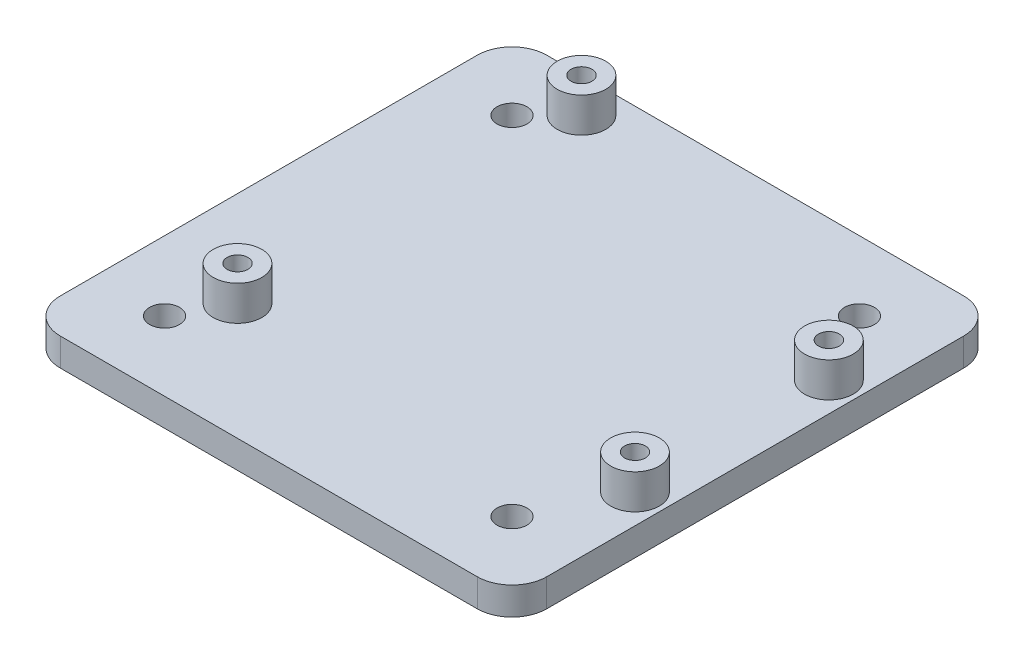
ISO-10303-21;
HEADER;
FILE_DESCRIPTION(('STEP AP214'),'2;1');
FILE_NAME('part.step','',(''),(''),'','','');
FILE_SCHEMA(('AUTOMOTIVE_DESIGN { 1 0 10303 214 1 1 1 1 }'));
ENDSEC;
DATA;
#1=APPLICATION_CONTEXT('core data for automotive mechanical design processes');
#2=APPLICATION_PROTOCOL_DEFINITION('international standard','automotive_design',2000,#1);
#3=PRODUCT_CONTEXT('',#1,'mechanical');
#4=PRODUCT('Part','Part','',(#3));
#5=PRODUCT_RELATED_PRODUCT_CATEGORY('part','',(#4));
#6=PRODUCT_DEFINITION_FORMATION('','',#4);
#7=PRODUCT_DEFINITION_CONTEXT('part definition',#1,'design');
#8=PRODUCT_DEFINITION('design','',#6,#7);
#9=PRODUCT_DEFINITION_SHAPE('','',#8);
#10=(LENGTH_UNIT() NAMED_UNIT(*) SI_UNIT(.MILLI.,.METRE.));
#11=(NAMED_UNIT(*) PLANE_ANGLE_UNIT() SI_UNIT($,.RADIAN.));
#12=(NAMED_UNIT(*) SI_UNIT($,.STERADIAN.) SOLID_ANGLE_UNIT());
#13=UNCERTAINTY_MEASURE_WITH_UNIT(LENGTH_MEASURE(1.E-05),#10,'distance_accuracy_value','');
#14=(GEOMETRIC_REPRESENTATION_CONTEXT(3) GLOBAL_UNCERTAINTY_ASSIGNED_CONTEXT((#13)) GLOBAL_UNIT_ASSIGNED_CONTEXT((#10,
#11,#12)) REPRESENTATION_CONTEXT('',''));
#15=CARTESIAN_POINT('',(0.,0.,0.));
#16=DIRECTION('',(0.,0.,1.));
#17=DIRECTION('',(1.,0.,0.));
#18=AXIS2_PLACEMENT_3D('',#15,#16,#17);
#19=CARTESIAN_POINT('',(0.,4.,0.));
#20=DIRECTION('',(0.,1.,0.));
#21=DIRECTION('',(0.,0.,1.));
#22=AXIS2_PLACEMENT_3D('',#19,#20,#21);
#23=PLANE('',#22);
#24=CARTESIAN_POINT('',(-21.3,4.,18.2));
#25=DIRECTION('',(0.,1.,0.));
#26=DIRECTION('',(0.,0.,1.));
#27=AXIS2_PLACEMENT_3D('',#24,#25,#26);
#28=CIRCLE('',#27,3.5);
#29=CARTESIAN_POINT('',(-21.3,4.,21.7));
#30=VERTEX_POINT('',#29);
#31=EDGE_CURVE('E240',#30,#30,#28,.T.);
#32=ORIENTED_EDGE('',*,*,#31,.F.);
#33=EDGE_LOOP('',(#32));
#34=FACE_BOUND('',#33,.T.);
#35=CARTESIAN_POINT('',(30.8,4.,13.1));
#36=DIRECTION('',(0.,1.,0.));
#37=DIRECTION('',(0.,0.,1.));
#38=AXIS2_PLACEMENT_3D('',#35,#36,#37);
#39=CIRCLE('',#38,3.5);
#40=CARTESIAN_POINT('',(30.8,4.,16.6));
#41=VERTEX_POINT('',#40);
#42=EDGE_CURVE('E231',#41,#41,#39,.T.);
#43=ORIENTED_EDGE('',*,*,#42,.F.);
#44=EDGE_LOOP('',(#43));
#45=FACE_BOUND('',#44,.T.);
#46=CARTESIAN_POINT('',(-20.,4.,-30.));
#47=DIRECTION('',(0.,1.,0.));
#48=DIRECTION('',(0.,0.,1.));
#49=AXIS2_PLACEMENT_3D('',#46,#47,#48);
#50=CIRCLE('',#49,3.5);
#51=CARTESIAN_POINT('',(-20.,4.,-26.5));
#52=VERTEX_POINT('',#51);
#53=EDGE_CURVE('E222',#52,#52,#50,.T.);
#54=ORIENTED_EDGE('',*,*,#53,.F.);
#55=EDGE_LOOP('',(#54));
#56=FACE_BOUND('',#55,.T.);
#57=CARTESIAN_POINT('',(30.8,4.,-14.8));
#58=DIRECTION('',(0.,1.,0.));
#59=DIRECTION('',(0.,0.,1.));
#60=AXIS2_PLACEMENT_3D('',#57,#58,#59);
#61=CIRCLE('',#60,3.5);
#62=CARTESIAN_POINT('',(30.8,4.,-11.3));
#63=VERTEX_POINT('',#62);
#64=EDGE_CURVE('E213',#63,#63,#61,.T.);
#65=ORIENTED_EDGE('',*,*,#64,.F.);
#66=EDGE_LOOP('',(#65));
#67=FACE_BOUND('',#66,.T.);
#68=CARTESIAN_POINT('',(-25.,4.,25.));
#69=DIRECTION('',(0.,1.,0.));
#70=DIRECTION('',(0.,0.,1.));
#71=AXIS2_PLACEMENT_3D('',#68,#69,#70);
#72=CIRCLE('',#71,2.15);
#73=CARTESIAN_POINT('',(-25.,4.,27.15));
#74=VERTEX_POINT('',#73);
#75=EDGE_CURVE('E198',#74,#74,#72,.T.);
#76=ORIENTED_EDGE('',*,*,#75,.F.);
#77=EDGE_LOOP('',(#76));
#78=FACE_BOUND('',#77,.T.);
#79=CARTESIAN_POINT('',(-25.,4.,-25.));
#80=DIRECTION('',(0.,1.,0.));
#81=DIRECTION('',(0.,0.,1.));
#82=AXIS2_PLACEMENT_3D('',#79,#80,#81);
#83=CIRCLE('',#82,2.15);
#84=CARTESIAN_POINT('',(-25.,4.,-22.85));
#85=VERTEX_POINT('',#84);
#86=EDGE_CURVE('E132',#85,#85,#83,.T.);
#87=ORIENTED_EDGE('',*,*,#86,.F.);
#88=EDGE_LOOP('',(#87));
#89=FACE_BOUND('',#88,.T.);
#90=DIRECTION('',(0.,0.,-1.));
#91=VECTOR('',#90,1.);
#92=CARTESIAN_POINT('',(35.,4.,-35.));
#93=LINE('',#92,#91);
#94=CARTESIAN_POINT('',(35.,4.,30.));
#95=VERTEX_POINT('',#94);
#96=CARTESIAN_POINT('',(35.,4.,-30.));
#97=VERTEX_POINT('',#96);
#98=EDGE_CURVE('E137',#95,#97,#93,.T.);
#99=ORIENTED_EDGE('',*,*,#98,.T.);
#100=CARTESIAN_POINT('',(30.,4.,-30.));
#101=DIRECTION('',(0.,1.,0.));
#102=DIRECTION('',(0.,0.,1.));
#103=AXIS2_PLACEMENT_3D('',#100,#101,#102);
#104=CIRCLE('',#103,5.);
#105=CARTESIAN_POINT('',(30.,4.,-35.));
#106=VERTEX_POINT('',#105);
#107=EDGE_CURVE('E164',#97,#106,#104,.T.);
#108=ORIENTED_EDGE('',*,*,#107,.T.);
#109=DIRECTION('',(-1.,0.,0.));
#110=VECTOR('',#109,1.);
#111=CARTESIAN_POINT('',(-35.,4.,-35.));
#112=LINE('',#111,#110);
#113=CARTESIAN_POINT('',(-30.,4.,-35.));
#114=VERTEX_POINT('',#113);
#115=EDGE_CURVE('E119',#106,#114,#112,.T.);
#116=ORIENTED_EDGE('',*,*,#115,.T.);
#117=CARTESIAN_POINT('',(-30.,4.,-30.));
#118=DIRECTION('',(0.,1.,0.));
#119=DIRECTION('',(0.,0.,1.));
#120=AXIS2_PLACEMENT_3D('',#117,#118,#119);
#121=CIRCLE('',#120,5.);
#122=CARTESIAN_POINT('',(-35.,4.,-30.));
#123=VERTEX_POINT('',#122);
#124=EDGE_CURVE('E159',#114,#123,#121,.T.);
#125=ORIENTED_EDGE('',*,*,#124,.T.);
#126=DIRECTION('',(0.,0.,1.));
#127=VECTOR('',#126,1.);
#128=CARTESIAN_POINT('',(-35.,4.,-35.));
#129=LINE('',#128,#127);
#130=CARTESIAN_POINT('',(-35.,4.,30.));
#131=VERTEX_POINT('',#130);
#132=EDGE_CURVE('E175',#123,#131,#129,.T.);
#133=ORIENTED_EDGE('',*,*,#132,.T.);
#134=CARTESIAN_POINT('',(-30.,4.,30.));
#135=DIRECTION('',(0.,1.,0.));
#136=DIRECTION('',(0.,0.,1.));
#137=AXIS2_PLACEMENT_3D('',#134,#135,#136);
#138=CIRCLE('',#137,5.);
#139=CARTESIAN_POINT('',(-30.,4.,35.));
#140=VERTEX_POINT('',#139);
#141=EDGE_CURVE('E55',#131,#140,#138,.T.);
#142=ORIENTED_EDGE('',*,*,#141,.T.);
#143=DIRECTION('',(1.,0.,0.));
#144=VECTOR('',#143,1.);
#145=CARTESIAN_POINT('',(-35.,4.,35.));
#146=LINE('',#145,#144);
#147=CARTESIAN_POINT('',(30.,4.,35.));
#148=VERTEX_POINT('',#147);
#149=EDGE_CURVE('E142',#140,#148,#146,.T.);
#150=ORIENTED_EDGE('',*,*,#149,.T.);
#151=CARTESIAN_POINT('',(30.,4.,30.));
#152=DIRECTION('',(0.,1.,0.));
#153=DIRECTION('',(0.,0.,1.));
#154=AXIS2_PLACEMENT_3D('',#151,#152,#153);
#155=CIRCLE('',#154,5.);
#156=EDGE_CURVE('E162',#148,#95,#155,.T.);
#157=ORIENTED_EDGE('',*,*,#156,.T.);
#158=EDGE_LOOP('',(#99,#108,#116,#125,#133,#142,#150,#157));
#159=FACE_BOUND('',#158,.T.);
#160=CARTESIAN_POINT('',(25.,4.,-25.));
#161=DIRECTION('',(0.,1.,0.));
#162=DIRECTION('',(0.,0.,1.));
#163=AXIS2_PLACEMENT_3D('',#160,#161,#162);
#164=CIRCLE('',#163,2.15);
#165=CARTESIAN_POINT('',(25.,4.,-22.85));
#166=VERTEX_POINT('',#165);
#167=EDGE_CURVE('E192',#166,#166,#164,.T.);
#168=ORIENTED_EDGE('',*,*,#167,.F.);
#169=EDGE_LOOP('',(#168));
#170=FACE_BOUND('',#169,.T.);
#171=CARTESIAN_POINT('',(25.,4.,25.));
#172=DIRECTION('',(0.,1.,0.));
#173=DIRECTION('',(0.,0.,1.));
#174=AXIS2_PLACEMENT_3D('',#171,#172,#173);
#175=CIRCLE('',#174,2.15);
#176=CARTESIAN_POINT('',(25.,4.,27.15));
#177=VERTEX_POINT('',#176);
#178=EDGE_CURVE('E204',#177,#177,#175,.T.);
#179=ORIENTED_EDGE('',*,*,#178,.F.);
#180=EDGE_LOOP('',(#179));
#181=FACE_BOUND('',#180,.T.);
#182=ADVANCED_FACE('F33',(#34,#45,#56,#67,#78,#89,#159,#170,#181),#23,.T.);
#183=CARTESIAN_POINT('',(0.,0.,0.));
#184=DIRECTION('',(0.,1.,0.));
#185=DIRECTION('',(0.,0.,1.));
#186=AXIS2_PLACEMENT_3D('',#183,#184,#185);
#187=PLANE('',#186);
#188=DIRECTION('',(-1.,0.,0.));
#189=VECTOR('',#188,1.);
#190=CARTESIAN_POINT('',(-35.,0.,-35.));
#191=LINE('',#190,#189);
#192=CARTESIAN_POINT('',(30.,0.,-35.));
#193=VERTEX_POINT('',#192);
#194=CARTESIAN_POINT('',(-30.,0.,-35.));
#195=VERTEX_POINT('',#194);
#196=EDGE_CURVE('E116',#193,#195,#191,.T.);
#197=ORIENTED_EDGE('',*,*,#196,.F.);
#198=CARTESIAN_POINT('',(30.,0.,-30.));
#199=DIRECTION('',(0.,1.,0.));
#200=DIRECTION('',(0.,0.,1.));
#201=AXIS2_PLACEMENT_3D('',#198,#199,#200);
#202=CIRCLE('',#201,5.);
#203=CARTESIAN_POINT('',(35.,0.,-30.));
#204=VERTEX_POINT('',#203);
#205=EDGE_CURVE('E99',#193,#204,#202,.F.);
#206=ORIENTED_EDGE('',*,*,#205,.T.);
#207=DIRECTION('',(0.,0.,-1.));
#208=VECTOR('',#207,1.);
#209=CARTESIAN_POINT('',(35.,0.,-35.));
#210=LINE('',#209,#208);
#211=CARTESIAN_POINT('',(35.,0.,30.));
#212=VERTEX_POINT('',#211);
#213=EDGE_CURVE('E127',#212,#204,#210,.T.);
#214=ORIENTED_EDGE('',*,*,#213,.F.);
#215=CARTESIAN_POINT('',(30.,0.,30.));
#216=DIRECTION('',(0.,1.,0.));
#217=DIRECTION('',(0.,0.,1.));
#218=AXIS2_PLACEMENT_3D('',#215,#216,#217);
#219=CIRCLE('',#218,5.);
#220=CARTESIAN_POINT('',(30.,0.,35.));
#221=VERTEX_POINT('',#220);
#222=EDGE_CURVE('E110',#212,#221,#219,.F.);
#223=ORIENTED_EDGE('',*,*,#222,.T.);
#224=DIRECTION('',(1.,0.,0.));
#225=VECTOR('',#224,1.);
#226=CARTESIAN_POINT('',(-35.,0.,35.));
#227=LINE('',#226,#225);
#228=CARTESIAN_POINT('',(-30.,0.,35.));
#229=VERTEX_POINT('',#228);
#230=EDGE_CURVE('E130',#229,#221,#227,.T.);
#231=ORIENTED_EDGE('',*,*,#230,.F.);
#232=CARTESIAN_POINT('',(-30.,0.,30.));
#233=DIRECTION('',(0.,1.,0.));
#234=DIRECTION('',(0.,0.,1.));
#235=AXIS2_PLACEMENT_3D('',#232,#233,#234);
#236=CIRCLE('',#235,5.);
#237=CARTESIAN_POINT('',(-35.,0.,30.));
#238=VERTEX_POINT('',#237);
#239=EDGE_CURVE('E153',#229,#238,#236,.F.);
#240=ORIENTED_EDGE('',*,*,#239,.T.);
#241=DIRECTION('',(0.,0.,1.));
#242=VECTOR('',#241,1.);
#243=CARTESIAN_POINT('',(-35.,0.,-35.));
#244=LINE('',#243,#242);
#245=CARTESIAN_POINT('',(-35.,0.,-30.));
#246=VERTEX_POINT('',#245);
#247=EDGE_CURVE('E126',#246,#238,#244,.T.);
#248=ORIENTED_EDGE('',*,*,#247,.F.);
#249=CARTESIAN_POINT('',(-30.,0.,-30.));
#250=DIRECTION('',(0.,1.,0.));
#251=DIRECTION('',(0.,0.,1.));
#252=AXIS2_PLACEMENT_3D('',#249,#250,#251);
#253=CIRCLE('',#252,5.);
#254=EDGE_CURVE('E120',#246,#195,#253,.F.);
#255=ORIENTED_EDGE('',*,*,#254,.T.);
#256=EDGE_LOOP('',(#197,#206,#214,#223,#231,#240,#248,#255));
#257=FACE_BOUND('',#256,.T.);
#258=CARTESIAN_POINT('',(-25.,0.,-25.));
#259=DIRECTION('',(0.,1.,0.));
#260=DIRECTION('',(0.,0.,1.));
#261=AXIS2_PLACEMENT_3D('',#258,#259,#260);
#262=CIRCLE('',#261,2.15);
#263=CARTESIAN_POINT('',(-25.,0.,-22.85));
#264=VERTEX_POINT('',#263);
#265=EDGE_CURVE('E189',#264,#264,#262,.T.);
#266=ORIENTED_EDGE('',*,*,#265,.T.);
#267=EDGE_LOOP('',(#266));
#268=FACE_BOUND('',#267,.T.);
#269=CARTESIAN_POINT('',(25.,0.,-25.));
#270=DIRECTION('',(0.,1.,0.));
#271=DIRECTION('',(0.,0.,1.));
#272=AXIS2_PLACEMENT_3D('',#269,#270,#271);
#273=CIRCLE('',#272,2.15);
#274=CARTESIAN_POINT('',(25.,0.,-22.85));
#275=VERTEX_POINT('',#274);
#276=EDGE_CURVE('E195',#275,#275,#273,.T.);
#277=ORIENTED_EDGE('',*,*,#276,.T.);
#278=EDGE_LOOP('',(#277));
#279=FACE_BOUND('',#278,.T.);
#280=CARTESIAN_POINT('',(-25.,0.,25.));
#281=DIRECTION('',(0.,1.,0.));
#282=DIRECTION('',(0.,0.,1.));
#283=AXIS2_PLACEMENT_3D('',#280,#281,#282);
#284=CIRCLE('',#283,2.15);
#285=CARTESIAN_POINT('',(-25.,0.,27.15));
#286=VERTEX_POINT('',#285);
#287=EDGE_CURVE('E201',#286,#286,#284,.T.);
#288=ORIENTED_EDGE('',*,*,#287,.T.);
#289=EDGE_LOOP('',(#288));
#290=FACE_BOUND('',#289,.T.);
#291=CARTESIAN_POINT('',(25.,0.,25.));
#292=DIRECTION('',(0.,1.,0.));
#293=DIRECTION('',(0.,0.,1.));
#294=AXIS2_PLACEMENT_3D('',#291,#292,#293);
#295=CIRCLE('',#294,2.15);
#296=CARTESIAN_POINT('',(25.,0.,27.15));
#297=VERTEX_POINT('',#296);
#298=EDGE_CURVE('E207',#297,#297,#295,.T.);
#299=ORIENTED_EDGE('',*,*,#298,.T.);
#300=EDGE_LOOP('',(#299));
#301=FACE_BOUND('',#300,.T.);
#302=ADVANCED_FACE('F123',(#257,#268,#279,#290,#301),#187,.F.);
#303=CARTESIAN_POINT('',(35.,4.,-35.));
#304=DIRECTION('',(-1.,0.,0.));
#305=DIRECTION('',(0.,0.,1.));
#306=AXIS2_PLACEMENT_3D('',#303,#304,#305);
#307=PLANE('',#306);
#308=ORIENTED_EDGE('',*,*,#213,.T.);
#309=DIRECTION('',(0.,-1.,0.));
#310=VECTOR('',#309,1.);
#311=CARTESIAN_POINT('',(35.,4.,-30.));
#312=LINE('',#311,#310);
#313=EDGE_CURVE('E104',#204,#97,#312,.F.);
#314=ORIENTED_EDGE('',*,*,#313,.T.);
#315=ORIENTED_EDGE('',*,*,#98,.F.);
#316=DIRECTION('',(0.,-1.,0.));
#317=VECTOR('',#316,1.);
#318=CARTESIAN_POINT('',(35.,4.,30.));
#319=LINE('',#318,#317);
#320=EDGE_CURVE('E109',#95,#212,#319,.T.);
#321=ORIENTED_EDGE('',*,*,#320,.T.);
#322=EDGE_LOOP('',(#308,#314,#315,#321));
#323=FACE_BOUND('',#322,.T.);
#324=ADVANCED_FACE('F276',(#323),#307,.F.);
#325=CARTESIAN_POINT('',(-35.,4.,-35.));
#326=DIRECTION('',(0.,0.,1.));
#327=DIRECTION('',(1.,0.,0.));
#328=AXIS2_PLACEMENT_3D('',#325,#326,#327);
#329=PLANE('',#328);
#330=ORIENTED_EDGE('',*,*,#115,.F.);
#331=DIRECTION('',(0.,-1.,0.));
#332=VECTOR('',#331,1.);
#333=CARTESIAN_POINT('',(30.,4.,-35.));
#334=LINE('',#333,#332);
#335=EDGE_CURVE('E103',#106,#193,#334,.T.);
#336=ORIENTED_EDGE('',*,*,#335,.T.);
#337=ORIENTED_EDGE('',*,*,#196,.T.);
#338=DIRECTION('',(0.,-1.,0.));
#339=VECTOR('',#338,1.);
#340=CARTESIAN_POINT('',(-30.,4.,-35.));
#341=LINE('',#340,#339);
#342=EDGE_CURVE('E121',#195,#114,#341,.F.);
#343=ORIENTED_EDGE('',*,*,#342,.T.);
#344=EDGE_LOOP('',(#330,#336,#337,#343));
#345=FACE_BOUND('',#344,.T.);
#346=ADVANCED_FACE('F115',(#345),#329,.F.);
#347=CARTESIAN_POINT('',(-35.,4.,-35.));
#348=DIRECTION('',(1.,0.,0.));
#349=DIRECTION('',(0.,0.,-1.));
#350=AXIS2_PLACEMENT_3D('',#347,#348,#349);
#351=PLANE('',#350);
#352=ORIENTED_EDGE('',*,*,#247,.T.);
#353=DIRECTION('',(0.,-1.,0.));
#354=VECTOR('',#353,1.);
#355=CARTESIAN_POINT('',(-35.,4.,30.));
#356=LINE('',#355,#354);
#357=EDGE_CURVE('E11',#238,#131,#356,.F.);
#358=ORIENTED_EDGE('',*,*,#357,.T.);
#359=ORIENTED_EDGE('',*,*,#132,.F.);
#360=DIRECTION('',(0.,-1.,0.));
#361=VECTOR('',#360,1.);
#362=CARTESIAN_POINT('',(-35.,4.,-30.));
#363=LINE('',#362,#361);
#364=EDGE_CURVE('E41',#123,#246,#363,.T.);
#365=ORIENTED_EDGE('',*,*,#364,.T.);
#366=EDGE_LOOP('',(#352,#358,#359,#365));
#367=FACE_BOUND('',#366,.T.);
#368=ADVANCED_FACE('F173',(#367),#351,.F.);
#369=CARTESIAN_POINT('',(-35.,4.,35.));
#370=DIRECTION('',(0.,0.,-1.));
#371=DIRECTION('',(-1.,0.,0.));
#372=AXIS2_PLACEMENT_3D('',#369,#370,#371);
#373=PLANE('',#372);
#374=ORIENTED_EDGE('',*,*,#230,.T.);
#375=DIRECTION('',(0.,-1.,0.));
#376=VECTOR('',#375,1.);
#377=CARTESIAN_POINT('',(30.,4.,35.));
#378=LINE('',#377,#376);
#379=EDGE_CURVE('E48',#221,#148,#378,.F.);
#380=ORIENTED_EDGE('',*,*,#379,.T.);
#381=ORIENTED_EDGE('',*,*,#149,.F.);
#382=DIRECTION('',(0.,-1.,0.));
#383=VECTOR('',#382,1.);
#384=CARTESIAN_POINT('',(-30.,4.,35.));
#385=LINE('',#384,#383);
#386=EDGE_CURVE('E166',#140,#229,#385,.T.);
#387=ORIENTED_EDGE('',*,*,#386,.T.);
#388=EDGE_LOOP('',(#374,#380,#381,#387));
#389=FACE_BOUND('',#388,.T.);
#390=ADVANCED_FACE('F182',(#389),#373,.F.);
#391=CARTESIAN_POINT('',(-25.,4.,-25.));
#392=DIRECTION('',(0.,-1.,0.));
#393=DIRECTION('',(0.,0.,-1.));
#394=AXIS2_PLACEMENT_3D('',#391,#392,#393);
#395=CYLINDRICAL_SURFACE('',#394,2.15);
#396=ORIENTED_EDGE('',*,*,#86,.T.);
#397=EDGE_LOOP('',(#396));
#398=FACE_BOUND('',#397,.T.);
#399=ORIENTED_EDGE('',*,*,#265,.F.);
#400=EDGE_LOOP('',(#399));
#401=FACE_BOUND('',#400,.T.);
#402=ADVANCED_FACE('F337',(#398,#401),#395,.F.);
#403=CARTESIAN_POINT('',(25.,4.,-25.));
#404=DIRECTION('',(0.,-1.,0.));
#405=DIRECTION('',(0.,0.,-1.));
#406=AXIS2_PLACEMENT_3D('',#403,#404,#405);
#407=CYLINDRICAL_SURFACE('',#406,2.15);
#408=ORIENTED_EDGE('',*,*,#167,.T.);
#409=EDGE_LOOP('',(#408));
#410=FACE_BOUND('',#409,.T.);
#411=ORIENTED_EDGE('',*,*,#276,.F.);
#412=EDGE_LOOP('',(#411));
#413=FACE_BOUND('',#412,.T.);
#414=ADVANCED_FACE('F334',(#410,#413),#407,.F.);
#415=CARTESIAN_POINT('',(-25.,4.,25.));
#416=DIRECTION('',(0.,-1.,0.));
#417=DIRECTION('',(0.,0.,-1.));
#418=AXIS2_PLACEMENT_3D('',#415,#416,#417);
#419=CYLINDRICAL_SURFACE('',#418,2.15);
#420=ORIENTED_EDGE('',*,*,#75,.T.);
#421=EDGE_LOOP('',(#420));
#422=FACE_BOUND('',#421,.T.);
#423=ORIENTED_EDGE('',*,*,#287,.F.);
#424=EDGE_LOOP('',(#423));
#425=FACE_BOUND('',#424,.T.);
#426=ADVANCED_FACE('F330',(#422,#425),#419,.F.);
#427=CARTESIAN_POINT('',(25.,4.,25.));
#428=DIRECTION('',(0.,-1.,0.));
#429=DIRECTION('',(0.,0.,-1.));
#430=AXIS2_PLACEMENT_3D('',#427,#428,#429);
#431=CYLINDRICAL_SURFACE('',#430,2.15);
#432=ORIENTED_EDGE('',*,*,#178,.T.);
#433=EDGE_LOOP('',(#432));
#434=FACE_BOUND('',#433,.T.);
#435=ORIENTED_EDGE('',*,*,#298,.F.);
#436=EDGE_LOOP('',(#435));
#437=FACE_BOUND('',#436,.T.);
#438=ADVANCED_FACE('F323',(#434,#437),#431,.F.);
#439=CARTESIAN_POINT('',(30.8,9.,-14.8));
#440=DIRECTION('',(0.,1.,0.));
#441=DIRECTION('',(0.,0.,1.));
#442=AXIS2_PLACEMENT_3D('',#439,#440,#441);
#443=PLANE('',#442);
#444=CARTESIAN_POINT('',(30.8,9.,-14.8));
#445=DIRECTION('',(0.,1.,0.));
#446=DIRECTION('',(0.,0.,1.));
#447=AXIS2_PLACEMENT_3D('',#444,#445,#446);
#448=CIRCLE('',#447,3.5);
#449=CARTESIAN_POINT('',(30.8,9.,-11.3));
#450=VERTEX_POINT('',#449);
#451=EDGE_CURVE('E210',#450,#450,#448,.T.);
#452=ORIENTED_EDGE('',*,*,#451,.T.);
#453=EDGE_LOOP('',(#452));
#454=FACE_BOUND('',#453,.T.);
#455=CARTESIAN_POINT('',(30.8,9.,-14.8));
#456=DIRECTION('',(0.,1.,0.));
#457=DIRECTION('',(0.,0.,1.));
#458=AXIS2_PLACEMENT_3D('',#455,#456,#457);
#459=CIRCLE('',#458,1.5);
#460=CARTESIAN_POINT('',(30.8,9.,-13.3));
#461=VERTEX_POINT('',#460);
#462=EDGE_CURVE('E216',#461,#461,#459,.T.);
#463=ORIENTED_EDGE('',*,*,#462,.F.);
#464=EDGE_LOOP('',(#463));
#465=FACE_BOUND('',#464,.T.);
#466=ADVANCED_FACE('F320',(#454,#465),#443,.T.);
#467=CARTESIAN_POINT('',(30.8,9.,-14.8));
#468=DIRECTION('',(0.,-1.,0.));
#469=DIRECTION('',(0.,0.,-1.));
#470=AXIS2_PLACEMENT_3D('',#467,#468,#469);
#471=CYLINDRICAL_SURFACE('',#470,3.5);
#472=ORIENTED_EDGE('',*,*,#451,.F.);
#473=EDGE_LOOP('',(#472));
#474=FACE_BOUND('',#473,.T.);
#475=ORIENTED_EDGE('',*,*,#64,.T.);
#476=EDGE_LOOP('',(#475));
#477=FACE_BOUND('',#476,.T.);
#478=ADVANCED_FACE('F294',(#474,#477),#471,.T.);
#479=CARTESIAN_POINT('',(30.8,9.,-14.8));
#480=DIRECTION('',(0.,-1.,0.));
#481=DIRECTION('',(0.,0.,-1.));
#482=AXIS2_PLACEMENT_3D('',#479,#480,#481);
#483=CYLINDRICAL_SURFACE('',#482,1.5);
#484=ORIENTED_EDGE('',*,*,#462,.T.);
#485=EDGE_LOOP('',(#484));
#486=FACE_BOUND('',#485,.T.);
#487=CARTESIAN_POINT('',(30.8,4.,-14.8));
#488=DIRECTION('',(0.,1.,0.));
#489=DIRECTION('',(0.,0.,1.));
#490=AXIS2_PLACEMENT_3D('',#487,#488,#489);
#491=CIRCLE('',#490,1.5);
#492=CARTESIAN_POINT('',(30.8,4.,-13.3));
#493=VERTEX_POINT('',#492);
#494=EDGE_CURVE('E138',#493,#493,#491,.F.);
#495=ORIENTED_EDGE('',*,*,#494,.T.);
#496=EDGE_LOOP('',(#495));
#497=FACE_BOUND('',#496,.T.);
#498=ADVANCED_FACE('F285',(#486,#497),#483,.F.);
#499=ORIENTED_EDGE('',*,*,#494,.F.);
#500=EDGE_LOOP('',(#499));
#501=FACE_BOUND('',#500,.T.);
#502=ADVANCED_FACE('F272',(#501),#23,.T.);
#503=CARTESIAN_POINT('',(-20.,9.,-30.));
#504=DIRECTION('',(0.,1.,0.));
#505=DIRECTION('',(0.,0.,1.));
#506=AXIS2_PLACEMENT_3D('',#503,#504,#505);
#507=PLANE('',#506);
#508=CARTESIAN_POINT('',(-20.,9.,-30.));
#509=DIRECTION('',(0.,1.,0.));
#510=DIRECTION('',(0.,0.,1.));
#511=AXIS2_PLACEMENT_3D('',#508,#509,#510);
#512=CIRCLE('',#511,3.5);
#513=CARTESIAN_POINT('',(-20.,9.,-26.5));
#514=VERTEX_POINT('',#513);
#515=EDGE_CURVE('E221',#514,#514,#512,.T.);
#516=ORIENTED_EDGE('',*,*,#515,.T.);
#517=EDGE_LOOP('',(#516));
#518=FACE_BOUND('',#517,.T.);
#519=CARTESIAN_POINT('',(-20.,9.,-30.));
#520=DIRECTION('',(0.,1.,0.));
#521=DIRECTION('',(0.,0.,1.));
#522=AXIS2_PLACEMENT_3D('',#519,#520,#521);
#523=CIRCLE('',#522,1.5);
#524=CARTESIAN_POINT('',(-20.,9.,-28.5));
#525=VERTEX_POINT('',#524);
#526=EDGE_CURVE('E225',#525,#525,#523,.T.);
#527=ORIENTED_EDGE('',*,*,#526,.F.);
#528=EDGE_LOOP('',(#527));
#529=FACE_BOUND('',#528,.T.);
#530=ADVANCED_FACE('F284',(#518,#529),#507,.T.);
#531=CARTESIAN_POINT('',(-20.,9.,-30.));
#532=DIRECTION('',(0.,-1.,0.));
#533=DIRECTION('',(0.,0.,-1.));
#534=AXIS2_PLACEMENT_3D('',#531,#532,#533);
#535=CYLINDRICAL_SURFACE('',#534,3.5);
#536=ORIENTED_EDGE('',*,*,#515,.F.);
#537=EDGE_LOOP('',(#536));
#538=FACE_BOUND('',#537,.T.);
#539=ORIENTED_EDGE('',*,*,#53,.T.);
#540=EDGE_LOOP('',(#539));
#541=FACE_BOUND('',#540,.T.);
#542=ADVANCED_FACE('F291',(#538,#541),#535,.T.);
#543=CARTESIAN_POINT('',(-20.,9.,-30.));
#544=DIRECTION('',(0.,-1.,0.));
#545=DIRECTION('',(0.,0.,-1.));
#546=AXIS2_PLACEMENT_3D('',#543,#544,#545);
#547=CYLINDRICAL_SURFACE('',#546,1.5);
#548=ORIENTED_EDGE('',*,*,#526,.T.);
#549=EDGE_LOOP('',(#548));
#550=FACE_BOUND('',#549,.T.);
#551=CARTESIAN_POINT('',(-20.,4.,-30.));
#552=DIRECTION('',(0.,1.,0.));
#553=DIRECTION('',(0.,0.,1.));
#554=AXIS2_PLACEMENT_3D('',#551,#552,#553);
#555=CIRCLE('',#554,1.5);
#556=CARTESIAN_POINT('',(-20.,4.,-28.5));
#557=VERTEX_POINT('',#556);
#558=EDGE_CURVE('E141',#557,#557,#555,.F.);
#559=ORIENTED_EDGE('',*,*,#558,.T.);
#560=EDGE_LOOP('',(#559));
#561=FACE_BOUND('',#560,.T.);
#562=ADVANCED_FACE('F300',(#550,#561),#547,.F.);
#563=ORIENTED_EDGE('',*,*,#558,.F.);
#564=EDGE_LOOP('',(#563));
#565=FACE_BOUND('',#564,.T.);
#566=ADVANCED_FACE('F267',(#565),#23,.T.);
#567=CARTESIAN_POINT('',(30.8,9.,13.1));
#568=DIRECTION('',(0.,1.,0.));
#569=DIRECTION('',(0.,0.,1.));
#570=AXIS2_PLACEMENT_3D('',#567,#568,#569);
#571=PLANE('',#570);
#572=CARTESIAN_POINT('',(30.8,9.,13.1));
#573=DIRECTION('',(0.,1.,0.));
#574=DIRECTION('',(0.,0.,1.));
#575=AXIS2_PLACEMENT_3D('',#572,#573,#574);
#576=CIRCLE('',#575,3.5);
#577=CARTESIAN_POINT('',(30.8,9.,16.6));
#578=VERTEX_POINT('',#577);
#579=EDGE_CURVE('E230',#578,#578,#576,.T.);
#580=ORIENTED_EDGE('',*,*,#579,.T.);
#581=EDGE_LOOP('',(#580));
#582=FACE_BOUND('',#581,.T.);
#583=CARTESIAN_POINT('',(30.8,9.,13.1));
#584=DIRECTION('',(0.,1.,0.));
#585=DIRECTION('',(0.,0.,1.));
#586=AXIS2_PLACEMENT_3D('',#583,#584,#585);
#587=CIRCLE('',#586,1.5);
#588=CARTESIAN_POINT('',(30.8,9.,14.6));
#589=VERTEX_POINT('',#588);
#590=EDGE_CURVE('E234',#589,#589,#587,.T.);
#591=ORIENTED_EDGE('',*,*,#590,.F.);
#592=EDGE_LOOP('',(#591));
#593=FACE_BOUND('',#592,.T.);
#594=ADVANCED_FACE('F299',(#582,#593),#571,.T.);
#595=CARTESIAN_POINT('',(30.8,9.,13.1));
#596=DIRECTION('',(0.,-1.,0.));
#597=DIRECTION('',(0.,0.,-1.));
#598=AXIS2_PLACEMENT_3D('',#595,#596,#597);
#599=CYLINDRICAL_SURFACE('',#598,3.5);
#600=ORIENTED_EDGE('',*,*,#579,.F.);
#601=EDGE_LOOP('',(#600));
#602=FACE_BOUND('',#601,.T.);
#603=ORIENTED_EDGE('',*,*,#42,.T.);
#604=EDGE_LOOP('',(#603));
#605=FACE_BOUND('',#604,.T.);
#606=ADVANCED_FACE('F306',(#602,#605),#599,.T.);
#607=CARTESIAN_POINT('',(30.8,9.,13.1));
#608=DIRECTION('',(0.,-1.,0.));
#609=DIRECTION('',(0.,0.,-1.));
#610=AXIS2_PLACEMENT_3D('',#607,#608,#609);
#611=CYLINDRICAL_SURFACE('',#610,1.5);
#612=ORIENTED_EDGE('',*,*,#590,.T.);
#613=EDGE_LOOP('',(#612));
#614=FACE_BOUND('',#613,.T.);
#615=CARTESIAN_POINT('',(30.8,4.,13.1));
#616=DIRECTION('',(0.,1.,0.));
#617=DIRECTION('',(0.,0.,1.));
#618=AXIS2_PLACEMENT_3D('',#615,#616,#617);
#619=CIRCLE('',#618,1.5);
#620=CARTESIAN_POINT('',(30.8,4.,14.6));
#621=VERTEX_POINT('',#620);
#622=EDGE_CURVE('E145',#621,#621,#619,.F.);
#623=ORIENTED_EDGE('',*,*,#622,.T.);
#624=EDGE_LOOP('',(#623));
#625=FACE_BOUND('',#624,.T.);
#626=ADVANCED_FACE('F264',(#614,#625),#611,.F.);
#627=ORIENTED_EDGE('',*,*,#622,.F.);
#628=EDGE_LOOP('',(#627));
#629=FACE_BOUND('',#628,.T.);
#630=ADVANCED_FACE('F255',(#629),#23,.T.);
#631=CARTESIAN_POINT('',(-21.3,9.,18.2));
#632=DIRECTION('',(0.,1.,0.));
#633=DIRECTION('',(0.,0.,1.));
#634=AXIS2_PLACEMENT_3D('',#631,#632,#633);
#635=PLANE('',#634);
#636=CARTESIAN_POINT('',(-21.3,9.,18.2));
#637=DIRECTION('',(0.,1.,0.));
#638=DIRECTION('',(0.,0.,1.));
#639=AXIS2_PLACEMENT_3D('',#636,#637,#638);
#640=CIRCLE('',#639,3.5);
#641=CARTESIAN_POINT('',(-21.3,9.,21.7));
#642=VERTEX_POINT('',#641);
#643=EDGE_CURVE('E239',#642,#642,#640,.T.);
#644=ORIENTED_EDGE('',*,*,#643,.T.);
#645=EDGE_LOOP('',(#644));
#646=FACE_BOUND('',#645,.T.);
#647=CARTESIAN_POINT('',(-21.3,9.,18.2));
#648=DIRECTION('',(0.,1.,0.));
#649=DIRECTION('',(0.,0.,1.));
#650=AXIS2_PLACEMENT_3D('',#647,#648,#649);
#651=CIRCLE('',#650,1.5);
#652=CARTESIAN_POINT('',(-21.3,9.,19.7));
#653=VERTEX_POINT('',#652);
#654=EDGE_CURVE('E243',#653,#653,#651,.T.);
#655=ORIENTED_EDGE('',*,*,#654,.F.);
#656=EDGE_LOOP('',(#655));
#657=FACE_BOUND('',#656,.T.);
#658=ADVANCED_FACE('F252',(#646,#657),#635,.T.);
#659=CARTESIAN_POINT('',(-21.3,9.,18.2));
#660=DIRECTION('',(0.,-1.,0.));
#661=DIRECTION('',(0.,0.,-1.));
#662=AXIS2_PLACEMENT_3D('',#659,#660,#661);
#663=CYLINDRICAL_SURFACE('',#662,3.5);
#664=ORIENTED_EDGE('',*,*,#643,.F.);
#665=EDGE_LOOP('',(#664));
#666=FACE_BOUND('',#665,.T.);
#667=ORIENTED_EDGE('',*,*,#31,.T.);
#668=EDGE_LOOP('',(#667));
#669=FACE_BOUND('',#668,.T.);
#670=ADVANCED_FACE('F254',(#666,#669),#663,.T.);
#671=CARTESIAN_POINT('',(-21.3,9.,18.2));
#672=DIRECTION('',(0.,-1.,0.));
#673=DIRECTION('',(0.,0.,-1.));
#674=AXIS2_PLACEMENT_3D('',#671,#672,#673);
#675=CYLINDRICAL_SURFACE('',#674,1.5);
#676=ORIENTED_EDGE('',*,*,#654,.T.);
#677=EDGE_LOOP('',(#676));
#678=FACE_BOUND('',#677,.T.);
#679=CARTESIAN_POINT('',(-21.3,4.,18.2));
#680=DIRECTION('',(0.,1.,0.));
#681=DIRECTION('',(0.,0.,1.));
#682=AXIS2_PLACEMENT_3D('',#679,#680,#681);
#683=CIRCLE('',#682,1.5);
#684=CARTESIAN_POINT('',(-21.3,4.,19.7));
#685=VERTEX_POINT('',#684);
#686=EDGE_CURVE('E148',#685,#685,#683,.F.);
#687=ORIENTED_EDGE('',*,*,#686,.T.);
#688=EDGE_LOOP('',(#687));
#689=FACE_BOUND('',#688,.T.);
#690=ADVANCED_FACE('F249',(#678,#689),#675,.F.);
#691=ORIENTED_EDGE('',*,*,#686,.F.);
#692=EDGE_LOOP('',(#691));
#693=FACE_BOUND('',#692,.T.);
#694=ADVANCED_FACE('F268',(#693),#23,.T.);
#695=CARTESIAN_POINT('',(30.,4.,-30.));
#696=DIRECTION('',(0.,-1.,0.));
#697=DIRECTION('',(0.,0.,-1.));
#698=AXIS2_PLACEMENT_3D('',#695,#696,#697);
#699=CYLINDRICAL_SURFACE('',#698,5.);
#700=ORIENTED_EDGE('',*,*,#107,.F.);
#701=ORIENTED_EDGE('',*,*,#313,.F.);
#702=ORIENTED_EDGE('',*,*,#205,.F.);
#703=ORIENTED_EDGE('',*,*,#335,.F.);
#704=EDGE_LOOP('',(#700,#701,#702,#703));
#705=FACE_BOUND('',#704,.T.);
#706=ADVANCED_FACE('F102',(#705),#699,.T.);
#707=CARTESIAN_POINT('',(30.,4.,30.));
#708=DIRECTION('',(0.,-1.,0.));
#709=DIRECTION('',(0.,0.,-1.));
#710=AXIS2_PLACEMENT_3D('',#707,#708,#709);
#711=CYLINDRICAL_SURFACE('',#710,5.);
#712=ORIENTED_EDGE('',*,*,#156,.F.);
#713=ORIENTED_EDGE('',*,*,#379,.F.);
#714=ORIENTED_EDGE('',*,*,#222,.F.);
#715=ORIENTED_EDGE('',*,*,#320,.F.);
#716=EDGE_LOOP('',(#712,#713,#714,#715));
#717=FACE_BOUND('',#716,.T.);
#718=ADVANCED_FACE('F366',(#717),#711,.T.);
#719=CARTESIAN_POINT('',(-30.,4.,30.));
#720=DIRECTION('',(0.,-1.,0.));
#721=DIRECTION('',(0.,0.,-1.));
#722=AXIS2_PLACEMENT_3D('',#719,#720,#721);
#723=CYLINDRICAL_SURFACE('',#722,5.);
#724=ORIENTED_EDGE('',*,*,#141,.F.);
#725=ORIENTED_EDGE('',*,*,#357,.F.);
#726=ORIENTED_EDGE('',*,*,#239,.F.);
#727=ORIENTED_EDGE('',*,*,#386,.F.);
#728=EDGE_LOOP('',(#724,#725,#726,#727));
#729=FACE_BOUND('',#728,.T.);
#730=ADVANCED_FACE('F181',(#729),#723,.T.);
#731=CARTESIAN_POINT('',(-30.,4.,-30.));
#732=DIRECTION('',(0.,-1.,0.));
#733=DIRECTION('',(0.,0.,-1.));
#734=AXIS2_PLACEMENT_3D('',#731,#732,#733);
#735=CYLINDRICAL_SURFACE('',#734,5.);
#736=ORIENTED_EDGE('',*,*,#124,.F.);
#737=ORIENTED_EDGE('',*,*,#342,.F.);
#738=ORIENTED_EDGE('',*,*,#254,.F.);
#739=ORIENTED_EDGE('',*,*,#364,.F.);
#740=EDGE_LOOP('',(#736,#737,#738,#739));
#741=FACE_BOUND('',#740,.T.);
#742=ADVANCED_FACE('F35',(#741),#735,.T.);
#743=CLOSED_SHELL('',(#182,#302,#324,#346,#368,#390,#402,#414,#426,#438,#466,#478,#498,#502,
#530,#542,#562,#566,#594,#606,#626,#630,#658,#670,#690,#694,#706,#718,#730,#742));
#744=MANIFOLD_SOLID_BREP('B2',#743);
#745=ADVANCED_BREP_SHAPE_REPRESENTATION('',(#18,#744),#14);
#746=SHAPE_DEFINITION_REPRESENTATION(#9,#745);
ENDSEC;
END-ISO-10303-21;
